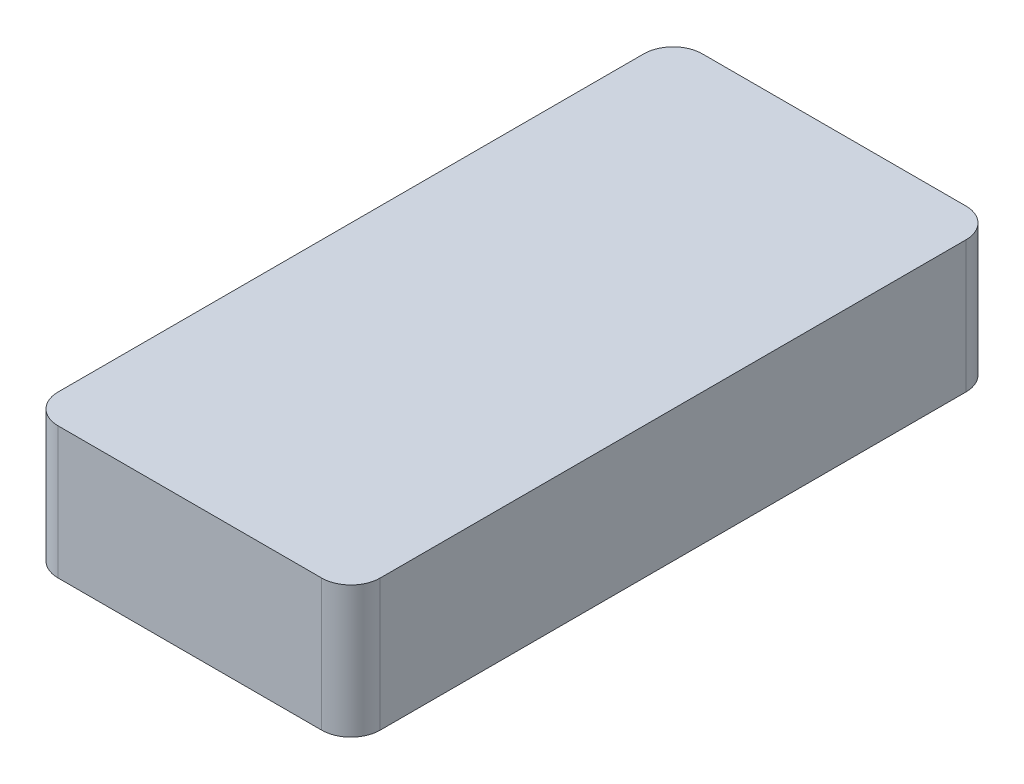
ISO-10303-21;
HEADER;
FILE_DESCRIPTION(('STEP AP214'),'2;1');
FILE_NAME('part.step','',(''),(''),'','','');
FILE_SCHEMA(('AUTOMOTIVE_DESIGN { 1 0 10303 214 1 1 1 1 }'));
ENDSEC;
DATA;
#1=APPLICATION_CONTEXT('core data for automotive mechanical design processes');
#2=APPLICATION_PROTOCOL_DEFINITION('international standard','automotive_design',2000,#1);
#3=PRODUCT_CONTEXT('',#1,'mechanical');
#4=PRODUCT('Part','Part','',(#3));
#5=PRODUCT_RELATED_PRODUCT_CATEGORY('part','',(#4));
#6=PRODUCT_DEFINITION_FORMATION('','',#4);
#7=PRODUCT_DEFINITION_CONTEXT('part definition',#1,'design');
#8=PRODUCT_DEFINITION('design','',#6,#7);
#9=PRODUCT_DEFINITION_SHAPE('','',#8);
#10=(LENGTH_UNIT() NAMED_UNIT(*) SI_UNIT(.MILLI.,.METRE.));
#11=(NAMED_UNIT(*) PLANE_ANGLE_UNIT() SI_UNIT($,.RADIAN.));
#12=(NAMED_UNIT(*) SI_UNIT($,.STERADIAN.) SOLID_ANGLE_UNIT());
#13=UNCERTAINTY_MEASURE_WITH_UNIT(LENGTH_MEASURE(1.E-05),#10,'distance_accuracy_value','');
#14=(GEOMETRIC_REPRESENTATION_CONTEXT(3) GLOBAL_UNCERTAINTY_ASSIGNED_CONTEXT((#13)) GLOBAL_UNIT_ASSIGNED_CONTEXT((#10,
#11,#12)) REPRESENTATION_CONTEXT('',''));
#15=CARTESIAN_POINT('',(0.,0.,0.));
#16=DIRECTION('',(0.,0.,1.));
#17=DIRECTION('',(1.,0.,0.));
#18=AXIS2_PLACEMENT_3D('',#15,#16,#17);
#19=CARTESIAN_POINT('',(11.,9.,-22.));
#20=DIRECTION('',(-1.,0.,0.));
#21=DIRECTION('',(0.,0.,1.));
#22=AXIS2_PLACEMENT_3D('',#19,#20,#21);
#23=PLANE('',#22);
#24=DIRECTION('',(0.,0.,-1.));
#25=VECTOR('',#24,1.);
#26=CARTESIAN_POINT('',(11.,0.,-22.));
#27=LINE('',#26,#25);
#28=CARTESIAN_POINT('',(11.,0.,20.));
#29=VERTEX_POINT('',#28);
#30=CARTESIAN_POINT('',(11.,0.,-20.));
#31=VERTEX_POINT('',#30);
#32=EDGE_CURVE('E141',#29,#31,#27,.T.);
#33=ORIENTED_EDGE('',*,*,#32,.T.);
#34=DIRECTION('',(0.,-1.,0.));
#35=VECTOR('',#34,1.);
#36=CARTESIAN_POINT('',(11.,9.,-20.));
#37=LINE('',#36,#35);
#38=CARTESIAN_POINT('',(11.,9.,-20.));
#39=VERTEX_POINT('',#38);
#40=EDGE_CURVE('E174',#31,#39,#37,.F.);
#41=ORIENTED_EDGE('',*,*,#40,.T.);
#42=DIRECTION('',(0.,0.,-1.));
#43=VECTOR('',#42,1.);
#44=CARTESIAN_POINT('',(11.,9.,-22.));
#45=LINE('',#44,#43);
#46=CARTESIAN_POINT('',(11.,9.,20.));
#47=VERTEX_POINT('',#46);
#48=EDGE_CURVE('E138',#47,#39,#45,.T.);
#49=ORIENTED_EDGE('',*,*,#48,.F.);
#50=DIRECTION('',(0.,-1.,0.));
#51=VECTOR('',#50,1.);
#52=CARTESIAN_POINT('',(11.,9.,20.));
#53=LINE('',#52,#51);
#54=EDGE_CURVE('E170',#47,#29,#53,.T.);
#55=ORIENTED_EDGE('',*,*,#54,.T.);
#56=EDGE_LOOP('',(#33,#41,#49,#55));
#57=FACE_BOUND('',#56,.T.);
#58=ADVANCED_FACE('F36',(#57),#23,.F.);
#59=CARTESIAN_POINT('',(-11.,9.,-22.));
#60=DIRECTION('',(0.,0.,1.));
#61=DIRECTION('',(1.,0.,0.));
#62=AXIS2_PLACEMENT_3D('',#59,#60,#61);
#63=PLANE('',#62);
#64=DIRECTION('',(-1.,0.,0.));
#65=VECTOR('',#64,1.);
#66=CARTESIAN_POINT('',(-11.,0.,-22.));
#67=LINE('',#66,#65);
#68=CARTESIAN_POINT('',(9.,0.,-22.));
#69=VERTEX_POINT('',#68);
#70=CARTESIAN_POINT('',(-9.,0.,-22.));
#71=VERTEX_POINT('',#70);
#72=EDGE_CURVE('E133',#69,#71,#67,.T.);
#73=ORIENTED_EDGE('',*,*,#72,.T.);
#74=DIRECTION('',(0.,-1.,0.));
#75=VECTOR('',#74,1.);
#76=CARTESIAN_POINT('',(-9.,9.,-22.));
#77=LINE('',#76,#75);
#78=CARTESIAN_POINT('',(-9.,9.,-22.));
#79=VERTEX_POINT('',#78);
#80=EDGE_CURVE('E108',#71,#79,#77,.F.);
#81=ORIENTED_EDGE('',*,*,#80,.T.);
#82=DIRECTION('',(-1.,0.,0.));
#83=VECTOR('',#82,1.);
#84=CARTESIAN_POINT('',(-11.,9.,-22.));
#85=LINE('',#84,#83);
#86=CARTESIAN_POINT('',(9.,9.,-22.));
#87=VERTEX_POINT('',#86);
#88=EDGE_CURVE('E180',#87,#79,#85,.T.);
#89=ORIENTED_EDGE('',*,*,#88,.F.);
#90=DIRECTION('',(0.,-1.,0.));
#91=VECTOR('',#90,1.);
#92=CARTESIAN_POINT('',(9.,9.,-22.));
#93=LINE('',#92,#91);
#94=EDGE_CURVE('E114',#87,#69,#93,.T.);
#95=ORIENTED_EDGE('',*,*,#94,.T.);
#96=EDGE_LOOP('',(#73,#81,#89,#95));
#97=FACE_BOUND('',#96,.T.);
#98=ADVANCED_FACE('F203',(#97),#63,.F.);
#99=CARTESIAN_POINT('',(-11.,9.,-22.));
#100=DIRECTION('',(1.,0.,0.));
#101=DIRECTION('',(0.,0.,-1.));
#102=AXIS2_PLACEMENT_3D('',#99,#100,#101);
#103=PLANE('',#102);
#104=DIRECTION('',(0.,0.,1.));
#105=VECTOR('',#104,1.);
#106=CARTESIAN_POINT('',(-11.,9.,-22.));
#107=LINE('',#106,#105);
#108=CARTESIAN_POINT('',(-11.,9.,-20.));
#109=VERTEX_POINT('',#108);
#110=CARTESIAN_POINT('',(-11.,9.,20.));
#111=VERTEX_POINT('',#110);
#112=EDGE_CURVE('E123',#109,#111,#107,.T.);
#113=ORIENTED_EDGE('',*,*,#112,.F.);
#114=DIRECTION('',(0.,-1.,0.));
#115=VECTOR('',#114,1.);
#116=CARTESIAN_POINT('',(-11.,9.,-20.));
#117=LINE('',#116,#115);
#118=CARTESIAN_POINT('',(-11.,0.,-20.));
#119=VERTEX_POINT('',#118);
#120=EDGE_CURVE('E107',#109,#119,#117,.T.);
#121=ORIENTED_EDGE('',*,*,#120,.T.);
#122=DIRECTION('',(0.,0.,1.));
#123=VECTOR('',#122,1.);
#124=CARTESIAN_POINT('',(-11.,0.,-22.));
#125=LINE('',#124,#123);
#126=CARTESIAN_POINT('',(-11.,0.,20.));
#127=VERTEX_POINT('',#126);
#128=EDGE_CURVE('E121',#119,#127,#125,.T.);
#129=ORIENTED_EDGE('',*,*,#128,.T.);
#130=DIRECTION('',(0.,-1.,0.));
#131=VECTOR('',#130,1.);
#132=CARTESIAN_POINT('',(-11.,9.,20.));
#133=LINE('',#132,#131);
#134=EDGE_CURVE('E126',#127,#111,#133,.F.);
#135=ORIENTED_EDGE('',*,*,#134,.T.);
#136=EDGE_LOOP('',(#113,#121,#129,#135));
#137=FACE_BOUND('',#136,.T.);
#138=ADVANCED_FACE('F120',(#137),#103,.F.);
#139=CARTESIAN_POINT('',(-11.,9.,22.));
#140=DIRECTION('',(0.,0.,-1.));
#141=DIRECTION('',(-1.,0.,0.));
#142=AXIS2_PLACEMENT_3D('',#139,#140,#141);
#143=PLANE('',#142);
#144=DIRECTION('',(1.,0.,0.));
#145=VECTOR('',#144,1.);
#146=CARTESIAN_POINT('',(-11.,9.,22.));
#147=LINE('',#146,#145);
#148=CARTESIAN_POINT('',(-9.,9.,22.));
#149=VERTEX_POINT('',#148);
#150=CARTESIAN_POINT('',(9.,9.,22.));
#151=VERTEX_POINT('',#150);
#152=EDGE_CURVE('E146',#149,#151,#147,.T.);
#153=ORIENTED_EDGE('',*,*,#152,.F.);
#154=DIRECTION('',(0.,-1.,0.));
#155=VECTOR('',#154,1.);
#156=CARTESIAN_POINT('',(-9.,9.,22.));
#157=LINE('',#156,#155);
#158=CARTESIAN_POINT('',(-9.,0.,22.));
#159=VERTEX_POINT('',#158);
#160=EDGE_CURVE('E11',#149,#159,#157,.T.);
#161=ORIENTED_EDGE('',*,*,#160,.T.);
#162=DIRECTION('',(1.,0.,0.));
#163=VECTOR('',#162,1.);
#164=CARTESIAN_POINT('',(-11.,0.,22.));
#165=LINE('',#164,#163);
#166=CARTESIAN_POINT('',(9.,0.,22.));
#167=VERTEX_POINT('',#166);
#168=EDGE_CURVE('E132',#159,#167,#165,.T.);
#169=ORIENTED_EDGE('',*,*,#168,.T.);
#170=DIRECTION('',(0.,-1.,0.));
#171=VECTOR('',#170,1.);
#172=CARTESIAN_POINT('',(9.,9.,22.));
#173=LINE('',#172,#171);
#174=EDGE_CURVE('E45',#167,#151,#173,.F.);
#175=ORIENTED_EDGE('',*,*,#174,.T.);
#176=EDGE_LOOP('',(#153,#161,#169,#175));
#177=FACE_BOUND('',#176,.T.);
#178=ADVANCED_FACE('F206',(#177),#143,.F.);
#179=CARTESIAN_POINT('',(0.,9.,0.));
#180=DIRECTION('',(0.,1.,0.));
#181=DIRECTION('',(0.,0.,1.));
#182=AXIS2_PLACEMENT_3D('',#179,#180,#181);
#183=PLANE('',#182);
#184=ORIENTED_EDGE('',*,*,#88,.T.);
#185=CARTESIAN_POINT('',(-9.,9.,-20.));
#186=DIRECTION('',(0.,1.,0.));
#187=DIRECTION('',(0.,0.,1.));
#188=AXIS2_PLACEMENT_3D('',#185,#186,#187);
#189=CIRCLE('',#188,2.);
#190=EDGE_CURVE('E167',#79,#109,#189,.T.);
#191=ORIENTED_EDGE('',*,*,#190,.T.);
#192=ORIENTED_EDGE('',*,*,#112,.T.);
#193=CARTESIAN_POINT('',(-9.,9.,20.));
#194=DIRECTION('',(0.,1.,0.));
#195=DIRECTION('',(0.,0.,1.));
#196=AXIS2_PLACEMENT_3D('',#193,#194,#195);
#197=CIRCLE('',#196,2.);
#198=EDGE_CURVE('E58',#111,#149,#197,.T.);
#199=ORIENTED_EDGE('',*,*,#198,.T.);
#200=ORIENTED_EDGE('',*,*,#152,.T.);
#201=CARTESIAN_POINT('',(9.,9.,20.));
#202=DIRECTION('',(0.,1.,0.));
#203=DIRECTION('',(0.,0.,1.));
#204=AXIS2_PLACEMENT_3D('',#201,#202,#203);
#205=CIRCLE('',#204,2.);
#206=EDGE_CURVE('E159',#151,#47,#205,.T.);
#207=ORIENTED_EDGE('',*,*,#206,.T.);
#208=ORIENTED_EDGE('',*,*,#48,.T.);
#209=CARTESIAN_POINT('',(9.,9.,-20.));
#210=DIRECTION('',(0.,1.,0.));
#211=DIRECTION('',(0.,0.,1.));
#212=AXIS2_PLACEMENT_3D('',#209,#210,#211);
#213=CIRCLE('',#212,2.);
#214=EDGE_CURVE('E164',#39,#87,#213,.T.);
#215=ORIENTED_EDGE('',*,*,#214,.T.);
#216=EDGE_LOOP('',(#184,#191,#192,#199,#200,#207,#208,#215));
#217=FACE_BOUND('',#216,.T.);
#218=ADVANCED_FACE('F191',(#217),#183,.T.);
#219=CARTESIAN_POINT('',(0.,0.,0.));
#220=DIRECTION('',(0.,1.,0.));
#221=DIRECTION('',(0.,0.,1.));
#222=AXIS2_PLACEMENT_3D('',#219,#220,#221);
#223=PLANE('',#222);
#224=ORIENTED_EDGE('',*,*,#128,.F.);
#225=CARTESIAN_POINT('',(-9.,0.,-20.));
#226=DIRECTION('',(0.,1.,0.));
#227=DIRECTION('',(0.,0.,1.));
#228=AXIS2_PLACEMENT_3D('',#225,#226,#227);
#229=CIRCLE('',#228,2.);
#230=EDGE_CURVE('E103',#119,#71,#229,.F.);
#231=ORIENTED_EDGE('',*,*,#230,.T.);
#232=ORIENTED_EDGE('',*,*,#72,.F.);
#233=CARTESIAN_POINT('',(9.,0.,-20.));
#234=DIRECTION('',(0.,1.,0.));
#235=DIRECTION('',(0.,0.,1.));
#236=AXIS2_PLACEMENT_3D('',#233,#234,#235);
#237=CIRCLE('',#236,2.);
#238=EDGE_CURVE('E115',#69,#31,#237,.F.);
#239=ORIENTED_EDGE('',*,*,#238,.T.);
#240=ORIENTED_EDGE('',*,*,#32,.F.);
#241=CARTESIAN_POINT('',(9.,0.,20.));
#242=DIRECTION('',(0.,1.,0.));
#243=DIRECTION('',(0.,0.,1.));
#244=AXIS2_PLACEMENT_3D('',#241,#242,#243);
#245=CIRCLE('',#244,2.);
#246=EDGE_CURVE('E125',#29,#167,#245,.F.);
#247=ORIENTED_EDGE('',*,*,#246,.T.);
#248=ORIENTED_EDGE('',*,*,#168,.F.);
#249=CARTESIAN_POINT('',(-9.,0.,20.));
#250=DIRECTION('',(0.,1.,0.));
#251=DIRECTION('',(0.,0.,1.));
#252=AXIS2_PLACEMENT_3D('',#249,#250,#251);
#253=CIRCLE('',#252,2.);
#254=EDGE_CURVE('E130',#159,#127,#253,.F.);
#255=ORIENTED_EDGE('',*,*,#254,.T.);
#256=EDGE_LOOP('',(#224,#231,#232,#239,#240,#247,#248,#255));
#257=FACE_BOUND('',#256,.T.);
#258=ADVANCED_FACE('F128',(#257),#223,.F.);
#259=CARTESIAN_POINT('',(-9.,9.,-20.));
#260=DIRECTION('',(0.,-1.,0.));
#261=DIRECTION('',(0.,0.,-1.));
#262=AXIS2_PLACEMENT_3D('',#259,#260,#261);
#263=CYLINDRICAL_SURFACE('',#262,2.);
#264=ORIENTED_EDGE('',*,*,#190,.F.);
#265=ORIENTED_EDGE('',*,*,#80,.F.);
#266=ORIENTED_EDGE('',*,*,#230,.F.);
#267=ORIENTED_EDGE('',*,*,#120,.F.);
#268=EDGE_LOOP('',(#264,#265,#266,#267));
#269=FACE_BOUND('',#268,.T.);
#270=ADVANCED_FACE('F106',(#269),#263,.T.);
#271=CARTESIAN_POINT('',(9.,9.,-20.));
#272=DIRECTION('',(0.,-1.,0.));
#273=DIRECTION('',(0.,0.,-1.));
#274=AXIS2_PLACEMENT_3D('',#271,#272,#273);
#275=CYLINDRICAL_SURFACE('',#274,2.);
#276=ORIENTED_EDGE('',*,*,#214,.F.);
#277=ORIENTED_EDGE('',*,*,#40,.F.);
#278=ORIENTED_EDGE('',*,*,#238,.F.);
#279=ORIENTED_EDGE('',*,*,#94,.F.);
#280=EDGE_LOOP('',(#276,#277,#278,#279));
#281=FACE_BOUND('',#280,.T.);
#282=ADVANCED_FACE('F200',(#281),#275,.T.);
#283=CARTESIAN_POINT('',(-9.,9.,20.));
#284=DIRECTION('',(0.,-1.,0.));
#285=DIRECTION('',(0.,0.,-1.));
#286=AXIS2_PLACEMENT_3D('',#283,#284,#285);
#287=CYLINDRICAL_SURFACE('',#286,2.);
#288=ORIENTED_EDGE('',*,*,#198,.F.);
#289=ORIENTED_EDGE('',*,*,#134,.F.);
#290=ORIENTED_EDGE('',*,*,#254,.F.);
#291=ORIENTED_EDGE('',*,*,#160,.F.);
#292=EDGE_LOOP('',(#288,#289,#290,#291));
#293=FACE_BOUND('',#292,.T.);
#294=ADVANCED_FACE('F205',(#293),#287,.T.);
#295=CARTESIAN_POINT('',(9.,9.,20.));
#296=DIRECTION('',(0.,-1.,0.));
#297=DIRECTION('',(0.,0.,-1.));
#298=AXIS2_PLACEMENT_3D('',#295,#296,#297);
#299=CYLINDRICAL_SURFACE('',#298,2.);
#300=ORIENTED_EDGE('',*,*,#206,.F.);
#301=ORIENTED_EDGE('',*,*,#174,.F.);
#302=ORIENTED_EDGE('',*,*,#246,.F.);
#303=ORIENTED_EDGE('',*,*,#54,.F.);
#304=EDGE_LOOP('',(#300,#301,#302,#303));
#305=FACE_BOUND('',#304,.T.);
#306=ADVANCED_FACE('F38',(#305),#299,.T.);
#307=CLOSED_SHELL('',(#58,#98,#138,#178,#218,#258,#270,#282,#294,#306));
#308=MANIFOLD_SOLID_BREP('B2',#307);
#309=ADVANCED_BREP_SHAPE_REPRESENTATION('',(#18,#308),#14);
#310=SHAPE_DEFINITION_REPRESENTATION(#9,#309);
ENDSEC;
END-ISO-10303-21;
